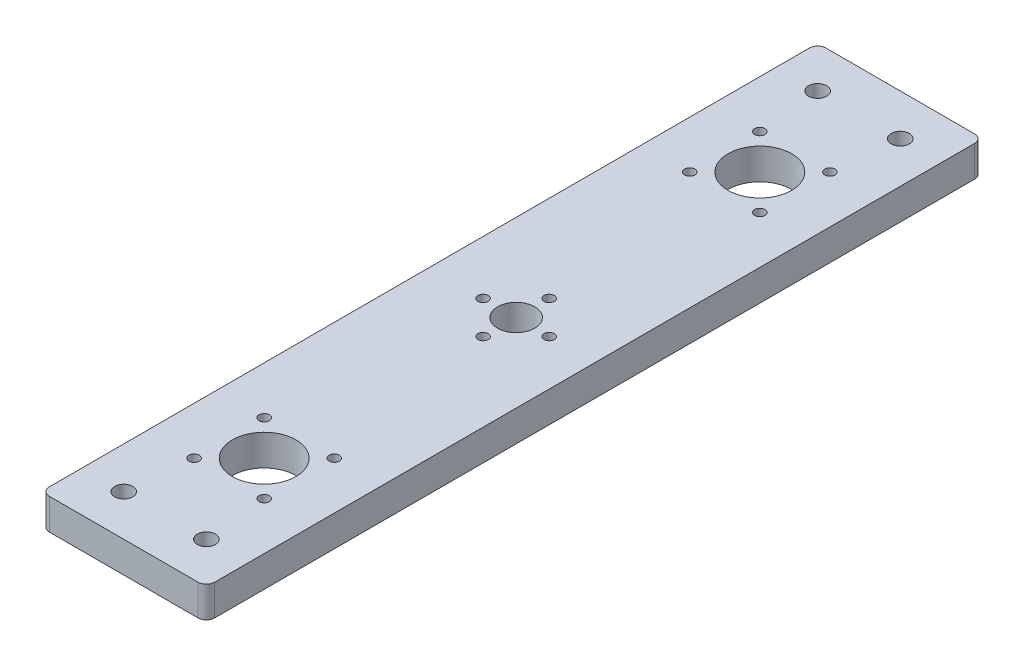
ISO-10303-21;
HEADER;
FILE_DESCRIPTION(('STEP AP214'),'2;1');
FILE_NAME('part.step','',(''),(''),'','','');
FILE_SCHEMA(('AUTOMOTIVE_DESIGN { 1 0 10303 214 1 1 1 1 }'));
ENDSEC;
DATA;
#1=APPLICATION_CONTEXT('core data for automotive mechanical design processes');
#2=APPLICATION_PROTOCOL_DEFINITION('international standard','automotive_design',2000,#1);
#3=PRODUCT_CONTEXT('',#1,'mechanical');
#4=PRODUCT('Part','Part','',(#3));
#5=PRODUCT_RELATED_PRODUCT_CATEGORY('part','',(#4));
#6=PRODUCT_DEFINITION_FORMATION('','',#4);
#7=PRODUCT_DEFINITION_CONTEXT('part definition',#1,'design');
#8=PRODUCT_DEFINITION('design','',#6,#7);
#9=PRODUCT_DEFINITION_SHAPE('','',#8);
#10=(LENGTH_UNIT() NAMED_UNIT(*) SI_UNIT(.MILLI.,.METRE.));
#11=(NAMED_UNIT(*) PLANE_ANGLE_UNIT() SI_UNIT($,.RADIAN.));
#12=(NAMED_UNIT(*) SI_UNIT($,.STERADIAN.) SOLID_ANGLE_UNIT());
#13=UNCERTAINTY_MEASURE_WITH_UNIT(LENGTH_MEASURE(1.E-05),#10,'distance_accuracy_value','');
#14=(GEOMETRIC_REPRESENTATION_CONTEXT(3) GLOBAL_UNCERTAINTY_ASSIGNED_CONTEXT((#13)) GLOBAL_UNIT_ASSIGNED_CONTEXT((#10,
#11,#12)) REPRESENTATION_CONTEXT('',''));
#15=CARTESIAN_POINT('',(0.,0.,0.));
#16=DIRECTION('',(0.,0.,1.));
#17=DIRECTION('',(1.,0.,0.));
#18=AXIS2_PLACEMENT_3D('',#15,#16,#17);
#19=CARTESIAN_POINT('',(0.,0.,0.));
#20=DIRECTION('',(0.,1.,0.));
#21=DIRECTION('',(0.,0.,1.));
#22=AXIS2_PLACEMENT_3D('',#19,#20,#21);
#23=PLANE('',#22);
#24=CARTESIAN_POINT('',(-8.48528137423856,0.,-68.4852813742386));
#25=DIRECTION('',(0.,-1.,0.));
#26=DIRECTION('',(0.,0.,-1.));
#27=AXIS2_PLACEMENT_3D('',#24,#25,#26);
#28=CIRCLE('',#27,1.25);
#29=CARTESIAN_POINT('',(-8.48528137423856,0.,-69.7352813742386));
#30=VERTEX_POINT('',#29);
#31=EDGE_CURVE('E270',#30,#30,#28,.T.);
#32=ORIENTED_EDGE('',*,*,#31,.F.);
#33=EDGE_LOOP('',(#32));
#34=FACE_BOUND('',#33,.T.);
#35=CARTESIAN_POINT('',(8.48528137423855,0.,-68.4852813742386));
#36=DIRECTION('',(0.,-1.,0.));
#37=DIRECTION('',(0.,0.,-1.));
#38=AXIS2_PLACEMENT_3D('',#35,#36,#37);
#39=CIRCLE('',#38,1.25);
#40=CARTESIAN_POINT('',(8.48528137423855,0.,-69.7352813742386));
#41=VERTEX_POINT('',#40);
#42=EDGE_CURVE('E264',#41,#41,#39,.T.);
#43=ORIENTED_EDGE('',*,*,#42,.F.);
#44=EDGE_LOOP('',(#43));
#45=FACE_BOUND('',#44,.T.);
#46=CARTESIAN_POINT('',(8.48528137423862,0.,-51.5147186257614));
#47=DIRECTION('',(0.,-1.,0.));
#48=DIRECTION('',(0.,0.,-1.));
#49=AXIS2_PLACEMENT_3D('',#46,#47,#48);
#50=CIRCLE('',#49,1.25);
#51=CARTESIAN_POINT('',(8.48528137423862,0.,-52.7647186257614));
#52=VERTEX_POINT('',#51);
#53=EDGE_CURVE('E258',#52,#52,#50,.T.);
#54=ORIENTED_EDGE('',*,*,#53,.F.);
#55=EDGE_LOOP('',(#54));
#56=FACE_BOUND('',#55,.T.);
#57=CARTESIAN_POINT('',(10.,0.,-84.));
#58=DIRECTION('',(0.,-1.,0.));
#59=DIRECTION('',(0.,0.,-1.));
#60=AXIS2_PLACEMENT_3D('',#57,#58,#59);
#61=CIRCLE('',#60,2.2);
#62=CARTESIAN_POINT('',(10.,0.,-86.2));
#63=VERTEX_POINT('',#62);
#64=EDGE_CURVE('E251',#63,#63,#61,.T.);
#65=ORIENTED_EDGE('',*,*,#64,.F.);
#66=EDGE_LOOP('',(#65));
#67=FACE_BOUND('',#66,.T.);
#68=CARTESIAN_POINT('',(-10.,0.,-84.));
#69=DIRECTION('',(0.,-1.,0.));
#70=DIRECTION('',(0.,0.,-1.));
#71=AXIS2_PLACEMENT_3D('',#68,#69,#70);
#72=CIRCLE('',#71,2.2);
#73=CARTESIAN_POINT('',(-10.,0.,-86.2));
#74=VERTEX_POINT('',#73);
#75=EDGE_CURVE('E244',#74,#74,#72,.T.);
#76=ORIENTED_EDGE('',*,*,#75,.F.);
#77=EDGE_LOOP('',(#76));
#78=FACE_BOUND('',#77,.T.);
#79=CARTESIAN_POINT('',(1.,0.,-8.));
#80=DIRECTION('',(0.,-1.,0.));
#81=DIRECTION('',(0.,0.,-1.));
#82=AXIS2_PLACEMENT_3D('',#79,#80,#81);
#83=CIRCLE('',#82,1.24999999999999);
#84=CARTESIAN_POINT('',(1.,0.,-9.24999999999999));
#85=VERTEX_POINT('',#84);
#86=EDGE_CURVE('E240',#85,#85,#83,.T.);
#87=ORIENTED_EDGE('',*,*,#86,.F.);
#88=EDGE_LOOP('',(#87));
#89=FACE_BOUND('',#88,.T.);
#90=CARTESIAN_POINT('',(-7.,0.,0.));
#91=DIRECTION('',(0.,-1.,0.));
#92=DIRECTION('',(0.,0.,-1.));
#93=AXIS2_PLACEMENT_3D('',#90,#91,#92);
#94=CIRCLE('',#93,1.24999999999999);
#95=CARTESIAN_POINT('',(-7.,0.,-1.24999999999999));
#96=VERTEX_POINT('',#95);
#97=EDGE_CURVE('E234',#96,#96,#94,.T.);
#98=ORIENTED_EDGE('',*,*,#97,.F.);
#99=EDGE_LOOP('',(#98));
#100=FACE_BOUND('',#99,.T.);
#101=CARTESIAN_POINT('',(9.,0.,0.));
#102=DIRECTION('',(0.,-1.,0.));
#103=DIRECTION('',(0.,0.,-1.));
#104=AXIS2_PLACEMENT_3D('',#101,#102,#103);
#105=CIRCLE('',#104,1.24999999999999);
#106=CARTESIAN_POINT('',(9.,0.,-1.24999999999999));
#107=VERTEX_POINT('',#106);
#108=EDGE_CURVE('E228',#107,#107,#105,.T.);
#109=ORIENTED_EDGE('',*,*,#108,.F.);
#110=EDGE_LOOP('',(#109));
#111=FACE_BOUND('',#110,.T.);
#112=CARTESIAN_POINT('',(1.,0.,8.));
#113=DIRECTION('',(0.,-1.,0.));
#114=DIRECTION('',(0.,0.,-1.));
#115=AXIS2_PLACEMENT_3D('',#112,#113,#114);
#116=CIRCLE('',#115,1.24999999999999);
#117=CARTESIAN_POINT('',(1.,0.,6.75000000000002));
#118=VERTEX_POINT('',#117);
#119=EDGE_CURVE('E222',#118,#118,#116,.T.);
#120=ORIENTED_EDGE('',*,*,#119,.F.);
#121=EDGE_LOOP('',(#120));
#122=FACE_BOUND('',#121,.T.);
#123=CARTESIAN_POINT('',(-8.48528137423844,0.,51.5147186257613));
#124=DIRECTION('',(0.,-1.,0.));
#125=DIRECTION('',(0.,0.,-1.));
#126=AXIS2_PLACEMENT_3D('',#123,#124,#125);
#127=CIRCLE('',#126,1.25);
#128=CARTESIAN_POINT('',(-8.48528137423844,0.,50.2647186257613));
#129=VERTEX_POINT('',#128);
#130=EDGE_CURVE('E216',#129,#129,#127,.T.);
#131=ORIENTED_EDGE('',*,*,#130,.F.);
#132=EDGE_LOOP('',(#131));
#133=FACE_BOUND('',#132,.T.);
#134=CARTESIAN_POINT('',(-8.48528137423856,0.,68.4852813742386));
#135=DIRECTION('',(0.,-1.,0.));
#136=DIRECTION('',(0.,0.,-1.));
#137=AXIS2_PLACEMENT_3D('',#134,#135,#136);
#138=CIRCLE('',#137,1.25);
#139=CARTESIAN_POINT('',(-8.48528137423856,0.,67.2352813742386));
#140=VERTEX_POINT('',#139);
#141=EDGE_CURVE('E210',#140,#140,#138,.T.);
#142=ORIENTED_EDGE('',*,*,#141,.F.);
#143=EDGE_LOOP('',(#142));
#144=FACE_BOUND('',#143,.T.);
#145=CARTESIAN_POINT('',(8.48528137423855,0.,68.4852813742386));
#146=DIRECTION('',(0.,-1.,0.));
#147=DIRECTION('',(0.,0.,-1.));
#148=AXIS2_PLACEMENT_3D('',#145,#146,#147);
#149=CIRCLE('',#148,1.25);
#150=CARTESIAN_POINT('',(8.48528137423855,0.,67.2352813742386));
#151=VERTEX_POINT('',#150);
#152=EDGE_CURVE('E204',#151,#151,#149,.T.);
#153=ORIENTED_EDGE('',*,*,#152,.F.);
#154=EDGE_LOOP('',(#153));
#155=FACE_BOUND('',#154,.T.);
#156=CARTESIAN_POINT('',(8.48528137423862,0.,51.5147186257614));
#157=DIRECTION('',(0.,-1.,0.));
#158=DIRECTION('',(0.,0.,-1.));
#159=AXIS2_PLACEMENT_3D('',#156,#157,#158);
#160=CIRCLE('',#159,1.25);
#161=CARTESIAN_POINT('',(8.48528137423862,0.,50.2647186257614));
#162=VERTEX_POINT('',#161);
#163=EDGE_CURVE('E198',#162,#162,#160,.T.);
#164=ORIENTED_EDGE('',*,*,#163,.F.);
#165=EDGE_LOOP('',(#164));
#166=FACE_BOUND('',#165,.T.);
#167=CARTESIAN_POINT('',(10.,0.,84.));
#168=DIRECTION('',(0.,1.,0.));
#169=DIRECTION('',(0.,0.,1.));
#170=AXIS2_PLACEMENT_3D('',#167,#168,#169);
#171=CIRCLE('',#170,2.2);
#172=CARTESIAN_POINT('',(10.,0.,86.2));
#173=VERTEX_POINT('',#172);
#174=EDGE_CURVE('E191',#173,#173,#171,.T.);
#175=ORIENTED_EDGE('',*,*,#174,.T.);
#176=EDGE_LOOP('',(#175));
#177=FACE_BOUND('',#176,.T.);
#178=CARTESIAN_POINT('',(-10.,0.,84.));
#179=DIRECTION('',(0.,1.,0.));
#180=DIRECTION('',(0.,0.,1.));
#181=AXIS2_PLACEMENT_3D('',#178,#179,#180);
#182=CIRCLE('',#181,2.2);
#183=CARTESIAN_POINT('',(-10.,0.,86.2));
#184=VERTEX_POINT('',#183);
#185=EDGE_CURVE('E184',#184,#184,#182,.T.);
#186=ORIENTED_EDGE('',*,*,#185,.T.);
#187=EDGE_LOOP('',(#186));
#188=FACE_BOUND('',#187,.T.);
#189=CARTESIAN_POINT('',(0.,0.,-60.));
#190=DIRECTION('',(0.,1.,0.));
#191=DIRECTION('',(0.,0.,1.));
#192=AXIS2_PLACEMENT_3D('',#189,#190,#191);
#193=CIRCLE('',#192,7.7);
#194=CARTESIAN_POINT('',(0.,0.,-52.3));
#195=VERTEX_POINT('',#194);
#196=EDGE_CURVE('E118',#195,#195,#193,.T.);
#197=ORIENTED_EDGE('',*,*,#196,.T.);
#198=EDGE_LOOP('',(#197));
#199=FACE_BOUND('',#198,.T.);
#200=CARTESIAN_POINT('',(0.,0.,60.));
#201=DIRECTION('',(0.,1.,0.));
#202=DIRECTION('',(0.,0.,1.));
#203=AXIS2_PLACEMENT_3D('',#200,#201,#202);
#204=CIRCLE('',#203,7.7);
#205=CARTESIAN_POINT('',(0.,0.,67.7));
#206=VERTEX_POINT('',#205);
#207=EDGE_CURVE('E176',#206,#206,#204,.T.);
#208=ORIENTED_EDGE('',*,*,#207,.T.);
#209=EDGE_LOOP('',(#208));
#210=FACE_BOUND('',#209,.T.);
#211=CARTESIAN_POINT('',(1.,0.,0.));
#212=DIRECTION('',(0.,1.,0.));
#213=DIRECTION('',(0.,0.,1.));
#214=AXIS2_PLACEMENT_3D('',#211,#212,#213);
#215=CIRCLE('',#214,4.5);
#216=CARTESIAN_POINT('',(1.,0.,4.5));
#217=VERTEX_POINT('',#216);
#218=EDGE_CURVE('E169',#217,#217,#215,.T.);
#219=ORIENTED_EDGE('',*,*,#218,.T.);
#220=EDGE_LOOP('',(#219));
#221=FACE_BOUND('',#220,.T.);
#222=DIRECTION('',(0.,0.,1.));
#223=VECTOR('',#222,1.);
#224=CARTESIAN_POINT('',(-20.,0.,94.));
#225=LINE('',#224,#223);
#226=CARTESIAN_POINT('',(-20.,0.,-92.));
#227=VERTEX_POINT('',#226);
#228=CARTESIAN_POINT('',(-20.,0.,92.));
#229=VERTEX_POINT('',#228);
#230=EDGE_CURVE('E101',#227,#229,#225,.T.);
#231=ORIENTED_EDGE('',*,*,#230,.F.);
#232=CARTESIAN_POINT('',(-18.,0.,-92.));
#233=DIRECTION('',(0.,1.,0.));
#234=DIRECTION('',(0.,0.,1.));
#235=AXIS2_PLACEMENT_3D('',#232,#233,#234);
#236=CIRCLE('',#235,2.);
#237=CARTESIAN_POINT('',(-18.,0.,-94.));
#238=VERTEX_POINT('',#237);
#239=EDGE_CURVE('E84',#227,#238,#236,.F.);
#240=ORIENTED_EDGE('',*,*,#239,.T.);
#241=DIRECTION('',(-1.,0.,0.));
#242=VECTOR('',#241,1.);
#243=CARTESIAN_POINT('',(20.,0.,-94.));
#244=LINE('',#243,#242);
#245=CARTESIAN_POINT('',(18.,0.,-94.));
#246=VERTEX_POINT('',#245);
#247=EDGE_CURVE('E125',#246,#238,#244,.T.);
#248=ORIENTED_EDGE('',*,*,#247,.F.);
#249=CARTESIAN_POINT('',(18.,0.,-92.));
#250=DIRECTION('',(0.,1.,0.));
#251=DIRECTION('',(0.,0.,1.));
#252=AXIS2_PLACEMENT_3D('',#249,#250,#251);
#253=CIRCLE('',#252,2.);
#254=CARTESIAN_POINT('',(20.,0.,-92.));
#255=VERTEX_POINT('',#254);
#256=EDGE_CURVE('E95',#246,#255,#253,.F.);
#257=ORIENTED_EDGE('',*,*,#256,.T.);
#258=DIRECTION('',(0.,0.,-1.));
#259=VECTOR('',#258,1.);
#260=CARTESIAN_POINT('',(20.,0.,94.));
#261=LINE('',#260,#259);
#262=CARTESIAN_POINT('',(20.,0.,92.));
#263=VERTEX_POINT('',#262);
#264=EDGE_CURVE('E115',#263,#255,#261,.T.);
#265=ORIENTED_EDGE('',*,*,#264,.F.);
#266=CARTESIAN_POINT('',(18.,0.,92.));
#267=DIRECTION('',(0.,1.,0.));
#268=DIRECTION('',(0.,0.,1.));
#269=AXIS2_PLACEMENT_3D('',#266,#267,#268);
#270=CIRCLE('',#269,2.);
#271=CARTESIAN_POINT('',(18.,0.,94.));
#272=VERTEX_POINT('',#271);
#273=EDGE_CURVE('E105',#263,#272,#270,.F.);
#274=ORIENTED_EDGE('',*,*,#273,.T.);
#275=DIRECTION('',(1.,0.,0.));
#276=VECTOR('',#275,1.);
#277=CARTESIAN_POINT('',(20.,0.,94.));
#278=LINE('',#277,#276);
#279=CARTESIAN_POINT('',(-18.,0.,94.));
#280=VERTEX_POINT('',#279);
#281=EDGE_CURVE('E111',#280,#272,#278,.T.);
#282=ORIENTED_EDGE('',*,*,#281,.F.);
#283=CARTESIAN_POINT('',(-18.,0.,92.));
#284=DIRECTION('',(0.,1.,0.));
#285=DIRECTION('',(0.,0.,1.));
#286=AXIS2_PLACEMENT_3D('',#283,#284,#285);
#287=CIRCLE('',#286,2.);
#288=EDGE_CURVE('E110',#280,#229,#287,.F.);
#289=ORIENTED_EDGE('',*,*,#288,.T.);
#290=EDGE_LOOP('',(#231,#240,#248,#257,#265,#274,#282,#289));
#291=FACE_BOUND('',#290,.T.);
#292=CARTESIAN_POINT('',(-8.48528137423844,0.,-51.5147186257613));
#293=DIRECTION('',(0.,-1.,0.));
#294=DIRECTION('',(0.,0.,-1.));
#295=AXIS2_PLACEMENT_3D('',#292,#293,#294);
#296=CIRCLE('',#295,1.25);
#297=CARTESIAN_POINT('',(-8.48528137423844,0.,-52.7647186257613));
#298=VERTEX_POINT('',#297);
#299=EDGE_CURVE('E276',#298,#298,#296,.T.);
#300=ORIENTED_EDGE('',*,*,#299,.F.);
#301=EDGE_LOOP('',(#300));
#302=FACE_BOUND('',#301,.T.);
#303=ADVANCED_FACE('F17',(#34,#45,#56,#67,#78,#89,#100,#111,#122,#133,#144,#155,#166,#177,#188,
#199,#210,#221,#291,#302),#23,.F.);
#304=CARTESIAN_POINT('',(0.,7.5,0.));
#305=DIRECTION('',(0.,1.,0.));
#306=DIRECTION('',(0.,0.,1.));
#307=AXIS2_PLACEMENT_3D('',#304,#305,#306);
#308=PLANE('',#307);
#309=CARTESIAN_POINT('',(-8.48528137423856,7.5,-68.4852813742386));
#310=DIRECTION('',(0.,-1.,0.));
#311=DIRECTION('',(0.,0.,-1.));
#312=AXIS2_PLACEMENT_3D('',#309,#310,#311);
#313=CIRCLE('',#312,1.25);
#314=CARTESIAN_POINT('',(-8.48528137423856,7.5,-69.7352813742386));
#315=VERTEX_POINT('',#314);
#316=EDGE_CURVE('E267',#315,#315,#313,.T.);
#317=ORIENTED_EDGE('',*,*,#316,.T.);
#318=EDGE_LOOP('',(#317));
#319=FACE_BOUND('',#318,.T.);
#320=CARTESIAN_POINT('',(8.48528137423862,7.5,-51.5147186257614));
#321=DIRECTION('',(0.,-1.,0.));
#322=DIRECTION('',(0.,0.,-1.));
#323=AXIS2_PLACEMENT_3D('',#320,#321,#322);
#324=CIRCLE('',#323,1.25);
#325=CARTESIAN_POINT('',(8.48528137423862,7.5,-52.7647186257614));
#326=VERTEX_POINT('',#325);
#327=EDGE_CURVE('E248',#326,#326,#324,.T.);
#328=ORIENTED_EDGE('',*,*,#327,.T.);
#329=EDGE_LOOP('',(#328));
#330=FACE_BOUND('',#329,.T.);
#331=CARTESIAN_POINT('',(10.,7.5,-84.));
#332=DIRECTION('',(0.,-1.,0.));
#333=DIRECTION('',(0.,0.,-1.));
#334=AXIS2_PLACEMENT_3D('',#331,#332,#333);
#335=CIRCLE('',#334,2.2);
#336=CARTESIAN_POINT('',(10.,7.5,-86.2));
#337=VERTEX_POINT('',#336);
#338=EDGE_CURVE('E243',#337,#337,#335,.T.);
#339=ORIENTED_EDGE('',*,*,#338,.T.);
#340=EDGE_LOOP('',(#339));
#341=FACE_BOUND('',#340,.T.);
#342=CARTESIAN_POINT('',(-10.,7.5,-84.));
#343=DIRECTION('',(0.,-1.,0.));
#344=DIRECTION('',(0.,0.,-1.));
#345=AXIS2_PLACEMENT_3D('',#342,#343,#344);
#346=CIRCLE('',#345,2.2);
#347=CARTESIAN_POINT('',(-10.,7.5,-86.2));
#348=VERTEX_POINT('',#347);
#349=EDGE_CURVE('E247',#348,#348,#346,.T.);
#350=ORIENTED_EDGE('',*,*,#349,.T.);
#351=EDGE_LOOP('',(#350));
#352=FACE_BOUND('',#351,.T.);
#353=CARTESIAN_POINT('',(1.,7.5,-8.));
#354=DIRECTION('',(0.,-1.,0.));
#355=DIRECTION('',(0.,0.,-1.));
#356=AXIS2_PLACEMENT_3D('',#353,#354,#355);
#357=CIRCLE('',#356,1.25);
#358=CARTESIAN_POINT('',(1.,7.5,-9.25));
#359=VERTEX_POINT('',#358);
#360=EDGE_CURVE('E237',#359,#359,#357,.T.);
#361=ORIENTED_EDGE('',*,*,#360,.T.);
#362=EDGE_LOOP('',(#361));
#363=FACE_BOUND('',#362,.T.);
#364=CARTESIAN_POINT('',(-7.,7.5,0.));
#365=DIRECTION('',(0.,-1.,0.));
#366=DIRECTION('',(0.,0.,-1.));
#367=AXIS2_PLACEMENT_3D('',#364,#365,#366);
#368=CIRCLE('',#367,1.25);
#369=CARTESIAN_POINT('',(-7.,7.5,-1.25));
#370=VERTEX_POINT('',#369);
#371=EDGE_CURVE('E231',#370,#370,#368,.T.);
#372=ORIENTED_EDGE('',*,*,#371,.T.);
#373=EDGE_LOOP('',(#372));
#374=FACE_BOUND('',#373,.T.);
#375=DIRECTION('',(-1.,0.,0.));
#376=VECTOR('',#375,1.);
#377=CARTESIAN_POINT('',(20.,7.5,-94.));
#378=LINE('',#377,#376);
#379=CARTESIAN_POINT('',(18.,7.5,-94.));
#380=VERTEX_POINT('',#379);
#381=CARTESIAN_POINT('',(-18.,7.5,-94.));
#382=VERTEX_POINT('',#381);
#383=EDGE_CURVE('E121',#380,#382,#378,.T.);
#384=ORIENTED_EDGE('',*,*,#383,.T.);
#385=CARTESIAN_POINT('',(-18.,7.5,-92.));
#386=DIRECTION('',(0.,1.,0.));
#387=DIRECTION('',(0.,0.,1.));
#388=AXIS2_PLACEMENT_3D('',#385,#386,#387);
#389=CIRCLE('',#388,2.);
#390=CARTESIAN_POINT('',(-20.,7.5,-92.));
#391=VERTEX_POINT('',#390);
#392=EDGE_CURVE('E139',#382,#391,#389,.T.);
#393=ORIENTED_EDGE('',*,*,#392,.T.);
#394=DIRECTION('',(0.,0.,1.));
#395=VECTOR('',#394,1.);
#396=CARTESIAN_POINT('',(-20.,7.5,94.));
#397=LINE('',#396,#395);
#398=CARTESIAN_POINT('',(-20.,7.5,92.));
#399=VERTEX_POINT('',#398);
#400=EDGE_CURVE('E104',#391,#399,#397,.T.);
#401=ORIENTED_EDGE('',*,*,#400,.T.);
#402=CARTESIAN_POINT('',(-18.,7.5,92.));
#403=DIRECTION('',(0.,1.,0.));
#404=DIRECTION('',(0.,0.,1.));
#405=AXIS2_PLACEMENT_3D('',#402,#403,#404);
#406=CIRCLE('',#405,2.);
#407=CARTESIAN_POINT('',(-18.,7.5,94.));
#408=VERTEX_POINT('',#407);
#409=EDGE_CURVE('E135',#399,#408,#406,.T.);
#410=ORIENTED_EDGE('',*,*,#409,.T.);
#411=DIRECTION('',(1.,0.,0.));
#412=VECTOR('',#411,1.);
#413=CARTESIAN_POINT('',(20.,7.5,94.));
#414=LINE('',#413,#412);
#415=CARTESIAN_POINT('',(18.,7.5,94.));
#416=VERTEX_POINT('',#415);
#417=EDGE_CURVE('E148',#408,#416,#414,.T.);
#418=ORIENTED_EDGE('',*,*,#417,.T.);
#419=CARTESIAN_POINT('',(18.,7.5,92.));
#420=DIRECTION('',(0.,1.,0.));
#421=DIRECTION('',(0.,0.,1.));
#422=AXIS2_PLACEMENT_3D('',#419,#420,#421);
#423=CIRCLE('',#422,2.);
#424=CARTESIAN_POINT('',(20.,7.5,92.));
#425=VERTEX_POINT('',#424);
#426=EDGE_CURVE('E39',#416,#425,#423,.T.);
#427=ORIENTED_EDGE('',*,*,#426,.T.);
#428=DIRECTION('',(0.,0.,-1.));
#429=VECTOR('',#428,1.);
#430=CARTESIAN_POINT('',(20.,7.5,94.));
#431=LINE('',#430,#429);
#432=CARTESIAN_POINT('',(20.,7.5,-92.));
#433=VERTEX_POINT('',#432);
#434=EDGE_CURVE('E155',#425,#433,#431,.T.);
#435=ORIENTED_EDGE('',*,*,#434,.T.);
#436=CARTESIAN_POINT('',(18.,7.5,-92.));
#437=DIRECTION('',(0.,1.,0.));
#438=DIRECTION('',(0.,0.,1.));
#439=AXIS2_PLACEMENT_3D('',#436,#437,#438);
#440=CIRCLE('',#439,2.);
#441=EDGE_CURVE('E137',#433,#380,#440,.T.);
#442=ORIENTED_EDGE('',*,*,#441,.T.);
#443=EDGE_LOOP('',(#384,#393,#401,#410,#418,#427,#435,#442));
#444=FACE_BOUND('',#443,.T.);
#445=CARTESIAN_POINT('',(1.,7.5,0.));
#446=DIRECTION('',(0.,1.,0.));
#447=DIRECTION('',(0.,0.,1.));
#448=AXIS2_PLACEMENT_3D('',#445,#446,#447);
#449=CIRCLE('',#448,4.5);
#450=CARTESIAN_POINT('',(1.,7.5,4.5));
#451=VERTEX_POINT('',#450);
#452=EDGE_CURVE('E172',#451,#451,#449,.T.);
#453=ORIENTED_EDGE('',*,*,#452,.F.);
#454=EDGE_LOOP('',(#453));
#455=FACE_BOUND('',#454,.T.);
#456=CARTESIAN_POINT('',(0.,7.5,60.));
#457=DIRECTION('',(0.,1.,0.));
#458=DIRECTION('',(0.,0.,1.));
#459=AXIS2_PLACEMENT_3D('',#456,#457,#458);
#460=CIRCLE('',#459,7.7);
#461=CARTESIAN_POINT('',(0.,7.5,67.7));
#462=VERTEX_POINT('',#461);
#463=EDGE_CURVE('E179',#462,#462,#460,.T.);
#464=ORIENTED_EDGE('',*,*,#463,.F.);
#465=EDGE_LOOP('',(#464));
#466=FACE_BOUND('',#465,.T.);
#467=CARTESIAN_POINT('',(0.,7.5,-60.));
#468=DIRECTION('',(0.,1.,0.));
#469=DIRECTION('',(0.,0.,1.));
#470=AXIS2_PLACEMENT_3D('',#467,#468,#469);
#471=CIRCLE('',#470,7.7);
#472=CARTESIAN_POINT('',(0.,7.5,-52.3));
#473=VERTEX_POINT('',#472);
#474=EDGE_CURVE('E112',#473,#473,#471,.T.);
#475=ORIENTED_EDGE('',*,*,#474,.F.);
#476=EDGE_LOOP('',(#475));
#477=FACE_BOUND('',#476,.T.);
#478=CARTESIAN_POINT('',(-10.,7.5,84.));
#479=DIRECTION('',(0.,1.,0.));
#480=DIRECTION('',(0.,0.,1.));
#481=AXIS2_PLACEMENT_3D('',#478,#479,#480);
#482=CIRCLE('',#481,2.2);
#483=CARTESIAN_POINT('',(-10.,7.5,86.2));
#484=VERTEX_POINT('',#483);
#485=EDGE_CURVE('E187',#484,#484,#482,.T.);
#486=ORIENTED_EDGE('',*,*,#485,.F.);
#487=EDGE_LOOP('',(#486));
#488=FACE_BOUND('',#487,.T.);
#489=CARTESIAN_POINT('',(10.,7.5,84.));
#490=DIRECTION('',(0.,1.,0.));
#491=DIRECTION('',(0.,0.,1.));
#492=AXIS2_PLACEMENT_3D('',#489,#490,#491);
#493=CIRCLE('',#492,2.2);
#494=CARTESIAN_POINT('',(10.,7.5,86.2));
#495=VERTEX_POINT('',#494);
#496=EDGE_CURVE('E173',#495,#495,#493,.T.);
#497=ORIENTED_EDGE('',*,*,#496,.F.);
#498=EDGE_LOOP('',(#497));
#499=FACE_BOUND('',#498,.T.);
#500=CARTESIAN_POINT('',(8.48528137423862,7.5,51.5147186257614));
#501=DIRECTION('',(0.,-1.,0.));
#502=DIRECTION('',(0.,0.,-1.));
#503=AXIS2_PLACEMENT_3D('',#500,#501,#502);
#504=CIRCLE('',#503,1.25);
#505=CARTESIAN_POINT('',(8.48528137423862,7.5,50.2647186257614));
#506=VERTEX_POINT('',#505);
#507=EDGE_CURVE('E188',#506,#506,#504,.T.);
#508=ORIENTED_EDGE('',*,*,#507,.T.);
#509=EDGE_LOOP('',(#508));
#510=FACE_BOUND('',#509,.T.);
#511=CARTESIAN_POINT('',(8.48528137423855,7.5,68.4852813742386));
#512=DIRECTION('',(0.,-1.,0.));
#513=DIRECTION('',(0.,0.,-1.));
#514=AXIS2_PLACEMENT_3D('',#511,#512,#513);
#515=CIRCLE('',#514,1.25);
#516=CARTESIAN_POINT('',(8.48528137423855,7.5,67.2352813742386));
#517=VERTEX_POINT('',#516);
#518=EDGE_CURVE('E201',#517,#517,#515,.T.);
#519=ORIENTED_EDGE('',*,*,#518,.T.);
#520=EDGE_LOOP('',(#519));
#521=FACE_BOUND('',#520,.T.);
#522=CARTESIAN_POINT('',(-8.48528137423856,7.5,68.4852813742386));
#523=DIRECTION('',(0.,-1.,0.));
#524=DIRECTION('',(0.,0.,-1.));
#525=AXIS2_PLACEMENT_3D('',#522,#523,#524);
#526=CIRCLE('',#525,1.25);
#527=CARTESIAN_POINT('',(-8.48528137423856,7.5,67.2352813742386));
#528=VERTEX_POINT('',#527);
#529=EDGE_CURVE('E207',#528,#528,#526,.T.);
#530=ORIENTED_EDGE('',*,*,#529,.T.);
#531=EDGE_LOOP('',(#530));
#532=FACE_BOUND('',#531,.T.);
#533=CARTESIAN_POINT('',(-8.48528137423844,7.5,51.5147186257613));
#534=DIRECTION('',(0.,-1.,0.));
#535=DIRECTION('',(0.,0.,-1.));
#536=AXIS2_PLACEMENT_3D('',#533,#534,#535);
#537=CIRCLE('',#536,1.25);
#538=CARTESIAN_POINT('',(-8.48528137423844,7.5,50.2647186257613));
#539=VERTEX_POINT('',#538);
#540=EDGE_CURVE('E213',#539,#539,#537,.T.);
#541=ORIENTED_EDGE('',*,*,#540,.T.);
#542=EDGE_LOOP('',(#541));
#543=FACE_BOUND('',#542,.T.);
#544=CARTESIAN_POINT('',(1.,7.5,8.));
#545=DIRECTION('',(0.,-1.,0.));
#546=DIRECTION('',(0.,0.,-1.));
#547=AXIS2_PLACEMENT_3D('',#544,#545,#546);
#548=CIRCLE('',#547,1.25);
#549=CARTESIAN_POINT('',(1.,7.5,6.75));
#550=VERTEX_POINT('',#549);
#551=EDGE_CURVE('E219',#550,#550,#548,.T.);
#552=ORIENTED_EDGE('',*,*,#551,.T.);
#553=EDGE_LOOP('',(#552));
#554=FACE_BOUND('',#553,.T.);
#555=CARTESIAN_POINT('',(9.,7.5,0.));
#556=DIRECTION('',(0.,-1.,0.));
#557=DIRECTION('',(0.,0.,-1.));
#558=AXIS2_PLACEMENT_3D('',#555,#556,#557);
#559=CIRCLE('',#558,1.25);
#560=CARTESIAN_POINT('',(9.,7.5,-1.25));
#561=VERTEX_POINT('',#560);
#562=EDGE_CURVE('E225',#561,#561,#559,.T.);
#563=ORIENTED_EDGE('',*,*,#562,.T.);
#564=EDGE_LOOP('',(#563));
#565=FACE_BOUND('',#564,.T.);
#566=CARTESIAN_POINT('',(8.48528137423855,7.5,-68.4852813742386));
#567=DIRECTION('',(0.,-1.,0.));
#568=DIRECTION('',(0.,0.,-1.));
#569=AXIS2_PLACEMENT_3D('',#566,#567,#568);
#570=CIRCLE('',#569,1.25);
#571=CARTESIAN_POINT('',(8.48528137423855,7.5,-69.7352813742386));
#572=VERTEX_POINT('',#571);
#573=EDGE_CURVE('E261',#572,#572,#570,.T.);
#574=ORIENTED_EDGE('',*,*,#573,.T.);
#575=EDGE_LOOP('',(#574));
#576=FACE_BOUND('',#575,.T.);
#577=CARTESIAN_POINT('',(-8.48528137423844,7.5,-51.5147186257613));
#578=DIRECTION('',(0.,-1.,0.));
#579=DIRECTION('',(0.,0.,-1.));
#580=AXIS2_PLACEMENT_3D('',#577,#578,#579);
#581=CIRCLE('',#580,1.25);
#582=CARTESIAN_POINT('',(-8.48528137423844,7.5,-52.7647186257613));
#583=VERTEX_POINT('',#582);
#584=EDGE_CURVE('E273',#583,#583,#581,.T.);
#585=ORIENTED_EDGE('',*,*,#584,.T.);
#586=EDGE_LOOP('',(#585));
#587=FACE_BOUND('',#586,.T.);
#588=ADVANCED_FACE('F152',(#319,#330,#341,#352,#363,#374,#444,#455,#466,#477,#488,#499,#510,
#521,#532,#543,#554,#565,#576,#587),#308,.T.);
#589=CARTESIAN_POINT('',(-20.,7.5,94.));
#590=DIRECTION('',(1.,0.,0.));
#591=DIRECTION('',(0.,0.,-1.));
#592=AXIS2_PLACEMENT_3D('',#589,#590,#591);
#593=PLANE('',#592);
#594=ORIENTED_EDGE('',*,*,#400,.F.);
#595=DIRECTION('',(0.,-1.,0.));
#596=VECTOR('',#595,1.);
#597=CARTESIAN_POINT('',(-20.,7.5,-92.));
#598=LINE('',#597,#596);
#599=EDGE_CURVE('E88',#391,#227,#598,.T.);
#600=ORIENTED_EDGE('',*,*,#599,.T.);
#601=ORIENTED_EDGE('',*,*,#230,.T.);
#602=DIRECTION('',(0.,-1.,0.));
#603=VECTOR('',#602,1.);
#604=CARTESIAN_POINT('',(-20.,7.5,92.));
#605=LINE('',#604,#603);
#606=EDGE_CURVE('E106',#229,#399,#605,.F.);
#607=ORIENTED_EDGE('',*,*,#606,.T.);
#608=EDGE_LOOP('',(#594,#600,#601,#607));
#609=FACE_BOUND('',#608,.T.);
#610=ADVANCED_FACE('F100',(#609),#593,.F.);
#611=CARTESIAN_POINT('',(20.,7.5,94.));
#612=DIRECTION('',(0.,0.,-1.));
#613=DIRECTION('',(-1.,0.,0.));
#614=AXIS2_PLACEMENT_3D('',#611,#612,#613);
#615=PLANE('',#614);
#616=ORIENTED_EDGE('',*,*,#417,.F.);
#617=DIRECTION('',(0.,-1.,0.));
#618=VECTOR('',#617,1.);
#619=CARTESIAN_POINT('',(-18.,7.5,94.));
#620=LINE('',#619,#618);
#621=EDGE_CURVE('E11',#408,#280,#620,.T.);
#622=ORIENTED_EDGE('',*,*,#621,.T.);
#623=ORIENTED_EDGE('',*,*,#281,.T.);
#624=DIRECTION('',(0.,-1.,0.));
#625=VECTOR('',#624,1.);
#626=CARTESIAN_POINT('',(18.,7.5,94.));
#627=LINE('',#626,#625);
#628=EDGE_CURVE('E25',#272,#416,#627,.F.);
#629=ORIENTED_EDGE('',*,*,#628,.T.);
#630=EDGE_LOOP('',(#616,#622,#623,#629));
#631=FACE_BOUND('',#630,.T.);
#632=ADVANCED_FACE('F147',(#631),#615,.F.);
#633=CARTESIAN_POINT('',(20.,7.5,94.));
#634=DIRECTION('',(-1.,0.,0.));
#635=DIRECTION('',(0.,0.,1.));
#636=AXIS2_PLACEMENT_3D('',#633,#634,#635);
#637=PLANE('',#636);
#638=ORIENTED_EDGE('',*,*,#264,.T.);
#639=DIRECTION('',(0.,-1.,0.));
#640=VECTOR('',#639,1.);
#641=CARTESIAN_POINT('',(20.,7.5,-92.));
#642=LINE('',#641,#640);
#643=EDGE_CURVE('E32',#255,#433,#642,.F.);
#644=ORIENTED_EDGE('',*,*,#643,.T.);
#645=ORIENTED_EDGE('',*,*,#434,.F.);
#646=DIRECTION('',(0.,-1.,0.));
#647=VECTOR('',#646,1.);
#648=CARTESIAN_POINT('',(20.,7.5,92.));
#649=LINE('',#648,#647);
#650=EDGE_CURVE('E141',#425,#263,#649,.T.);
#651=ORIENTED_EDGE('',*,*,#650,.T.);
#652=EDGE_LOOP('',(#638,#644,#645,#651));
#653=FACE_BOUND('',#652,.T.);
#654=ADVANCED_FACE('F159',(#653),#637,.F.);
#655=CARTESIAN_POINT('',(20.,7.5,-94.));
#656=DIRECTION('',(0.,0.,1.));
#657=DIRECTION('',(1.,0.,0.));
#658=AXIS2_PLACEMENT_3D('',#655,#656,#657);
#659=PLANE('',#658);
#660=ORIENTED_EDGE('',*,*,#247,.T.);
#661=DIRECTION('',(0.,-1.,0.));
#662=VECTOR('',#661,1.);
#663=CARTESIAN_POINT('',(-18.,7.5,-94.));
#664=LINE('',#663,#662);
#665=EDGE_CURVE('E89',#238,#382,#664,.F.);
#666=ORIENTED_EDGE('',*,*,#665,.T.);
#667=ORIENTED_EDGE('',*,*,#383,.F.);
#668=DIRECTION('',(0.,-1.,0.));
#669=VECTOR('',#668,1.);
#670=CARTESIAN_POINT('',(18.,7.5,-94.));
#671=LINE('',#670,#669);
#672=EDGE_CURVE('E94',#380,#246,#671,.T.);
#673=ORIENTED_EDGE('',*,*,#672,.T.);
#674=EDGE_LOOP('',(#660,#666,#667,#673));
#675=FACE_BOUND('',#674,.T.);
#676=ADVANCED_FACE('F166',(#675),#659,.F.);
#677=CARTESIAN_POINT('',(1.,7.5,0.));
#678=DIRECTION('',(0.,-1.,0.));
#679=DIRECTION('',(0.,0.,-1.));
#680=AXIS2_PLACEMENT_3D('',#677,#678,#679);
#681=CYLINDRICAL_SURFACE('',#680,4.5);
#682=ORIENTED_EDGE('',*,*,#452,.T.);
#683=EDGE_LOOP('',(#682));
#684=FACE_BOUND('',#683,.T.);
#685=ORIENTED_EDGE('',*,*,#218,.F.);
#686=EDGE_LOOP('',(#685));
#687=FACE_BOUND('',#686,.T.);
#688=ADVANCED_FACE('F297',(#684,#687),#681,.F.);
#689=CARTESIAN_POINT('',(0.,7.5,60.));
#690=DIRECTION('',(0.,-1.,0.));
#691=DIRECTION('',(0.,0.,-1.));
#692=AXIS2_PLACEMENT_3D('',#689,#690,#691);
#693=CYLINDRICAL_SURFACE('',#692,7.7);
#694=ORIENTED_EDGE('',*,*,#463,.T.);
#695=EDGE_LOOP('',(#694));
#696=FACE_BOUND('',#695,.T.);
#697=ORIENTED_EDGE('',*,*,#207,.F.);
#698=EDGE_LOOP('',(#697));
#699=FACE_BOUND('',#698,.T.);
#700=ADVANCED_FACE('F506',(#696,#699),#693,.F.);
#701=CARTESIAN_POINT('',(0.,7.5,-60.));
#702=DIRECTION('',(0.,-1.,0.));
#703=DIRECTION('',(0.,0.,-1.));
#704=AXIS2_PLACEMENT_3D('',#701,#702,#703);
#705=CYLINDRICAL_SURFACE('',#704,7.7);
#706=ORIENTED_EDGE('',*,*,#474,.T.);
#707=EDGE_LOOP('',(#706));
#708=FACE_BOUND('',#707,.T.);
#709=ORIENTED_EDGE('',*,*,#196,.F.);
#710=EDGE_LOOP('',(#709));
#711=FACE_BOUND('',#710,.T.);
#712=ADVANCED_FACE('F496',(#708,#711),#705,.F.);
#713=CARTESIAN_POINT('',(-10.,7.5,84.));
#714=DIRECTION('',(0.,-1.,0.));
#715=DIRECTION('',(0.,0.,-1.));
#716=AXIS2_PLACEMENT_3D('',#713,#714,#715);
#717=CYLINDRICAL_SURFACE('',#716,2.2);
#718=ORIENTED_EDGE('',*,*,#485,.T.);
#719=EDGE_LOOP('',(#718));
#720=FACE_BOUND('',#719,.T.);
#721=ORIENTED_EDGE('',*,*,#185,.F.);
#722=EDGE_LOOP('',(#721));
#723=FACE_BOUND('',#722,.T.);
#724=ADVANCED_FACE('F486',(#720,#723),#717,.F.);
#725=CARTESIAN_POINT('',(10.,7.5,84.));
#726=DIRECTION('',(0.,-1.,0.));
#727=DIRECTION('',(0.,0.,-1.));
#728=AXIS2_PLACEMENT_3D('',#725,#726,#727);
#729=CYLINDRICAL_SURFACE('',#728,2.2);
#730=ORIENTED_EDGE('',*,*,#496,.T.);
#731=EDGE_LOOP('',(#730));
#732=FACE_BOUND('',#731,.T.);
#733=ORIENTED_EDGE('',*,*,#174,.F.);
#734=EDGE_LOOP('',(#733));
#735=FACE_BOUND('',#734,.T.);
#736=ADVANCED_FACE('F476',(#732,#735),#729,.F.);
#737=CARTESIAN_POINT('',(8.48528137423862,0.,51.5147186257614));
#738=DIRECTION('',(0.,-1.,0.));
#739=DIRECTION('',(0.,0.,-1.));
#740=AXIS2_PLACEMENT_3D('',#737,#738,#739);
#741=CYLINDRICAL_SURFACE('',#740,1.25);
#742=ORIENTED_EDGE('',*,*,#507,.F.);
#743=EDGE_LOOP('',(#742));
#744=FACE_BOUND('',#743,.T.);
#745=ORIENTED_EDGE('',*,*,#163,.T.);
#746=EDGE_LOOP('',(#745));
#747=FACE_BOUND('',#746,.T.);
#748=ADVANCED_FACE('F466',(#744,#747),#741,.F.);
#749=CARTESIAN_POINT('',(8.48528137423855,0.,68.4852813742386));
#750=DIRECTION('',(0.,-1.,0.));
#751=DIRECTION('',(0.,0.,-1.));
#752=AXIS2_PLACEMENT_3D('',#749,#750,#751);
#753=CYLINDRICAL_SURFACE('',#752,1.25);
#754=ORIENTED_EDGE('',*,*,#518,.F.);
#755=EDGE_LOOP('',(#754));
#756=FACE_BOUND('',#755,.T.);
#757=ORIENTED_EDGE('',*,*,#152,.T.);
#758=EDGE_LOOP('',(#757));
#759=FACE_BOUND('',#758,.T.);
#760=ADVANCED_FACE('F456',(#756,#759),#753,.F.);
#761=CARTESIAN_POINT('',(-8.48528137423856,0.,68.4852813742386));
#762=DIRECTION('',(0.,-1.,0.));
#763=DIRECTION('',(0.,0.,-1.));
#764=AXIS2_PLACEMENT_3D('',#761,#762,#763);
#765=CYLINDRICAL_SURFACE('',#764,1.25);
#766=ORIENTED_EDGE('',*,*,#529,.F.);
#767=EDGE_LOOP('',(#766));
#768=FACE_BOUND('',#767,.T.);
#769=ORIENTED_EDGE('',*,*,#141,.T.);
#770=EDGE_LOOP('',(#769));
#771=FACE_BOUND('',#770,.T.);
#772=ADVANCED_FACE('F446',(#768,#771),#765,.F.);
#773=CARTESIAN_POINT('',(-8.48528137423844,0.,51.5147186257613));
#774=DIRECTION('',(0.,-1.,0.));
#775=DIRECTION('',(0.,0.,-1.));
#776=AXIS2_PLACEMENT_3D('',#773,#774,#775);
#777=CYLINDRICAL_SURFACE('',#776,1.25);
#778=ORIENTED_EDGE('',*,*,#540,.F.);
#779=EDGE_LOOP('',(#778));
#780=FACE_BOUND('',#779,.T.);
#781=ORIENTED_EDGE('',*,*,#130,.T.);
#782=EDGE_LOOP('',(#781));
#783=FACE_BOUND('',#782,.T.);
#784=ADVANCED_FACE('F436',(#780,#783),#777,.F.);
#785=CARTESIAN_POINT('',(1.,0.,8.));
#786=DIRECTION('',(0.,-1.,0.));
#787=DIRECTION('',(0.,0.,-1.));
#788=AXIS2_PLACEMENT_3D('',#785,#786,#787);
#789=CYLINDRICAL_SURFACE('',#788,1.25);
#790=ORIENTED_EDGE('',*,*,#551,.F.);
#791=EDGE_LOOP('',(#790));
#792=FACE_BOUND('',#791,.T.);
#793=ORIENTED_EDGE('',*,*,#119,.T.);
#794=EDGE_LOOP('',(#793));
#795=FACE_BOUND('',#794,.T.);
#796=ADVANCED_FACE('F426',(#792,#795),#789,.F.);
#797=CARTESIAN_POINT('',(9.,0.,0.));
#798=DIRECTION('',(0.,-1.,0.));
#799=DIRECTION('',(0.,0.,-1.));
#800=AXIS2_PLACEMENT_3D('',#797,#798,#799);
#801=CYLINDRICAL_SURFACE('',#800,1.25);
#802=ORIENTED_EDGE('',*,*,#562,.F.);
#803=EDGE_LOOP('',(#802));
#804=FACE_BOUND('',#803,.T.);
#805=ORIENTED_EDGE('',*,*,#108,.T.);
#806=EDGE_LOOP('',(#805));
#807=FACE_BOUND('',#806,.T.);
#808=ADVANCED_FACE('F416',(#804,#807),#801,.F.);
#809=CARTESIAN_POINT('',(-7.,0.,0.));
#810=DIRECTION('',(0.,-1.,0.));
#811=DIRECTION('',(0.,0.,-1.));
#812=AXIS2_PLACEMENT_3D('',#809,#810,#811);
#813=CYLINDRICAL_SURFACE('',#812,1.25);
#814=ORIENTED_EDGE('',*,*,#371,.F.);
#815=EDGE_LOOP('',(#814));
#816=FACE_BOUND('',#815,.T.);
#817=ORIENTED_EDGE('',*,*,#97,.T.);
#818=EDGE_LOOP('',(#817));
#819=FACE_BOUND('',#818,.T.);
#820=ADVANCED_FACE('F406',(#816,#819),#813,.F.);
#821=CARTESIAN_POINT('',(1.,0.,-8.));
#822=DIRECTION('',(0.,-1.,0.));
#823=DIRECTION('',(0.,0.,-1.));
#824=AXIS2_PLACEMENT_3D('',#821,#822,#823);
#825=CYLINDRICAL_SURFACE('',#824,1.25);
#826=ORIENTED_EDGE('',*,*,#360,.F.);
#827=EDGE_LOOP('',(#826));
#828=FACE_BOUND('',#827,.T.);
#829=ORIENTED_EDGE('',*,*,#86,.T.);
#830=EDGE_LOOP('',(#829));
#831=FACE_BOUND('',#830,.T.);
#832=ADVANCED_FACE('F396',(#828,#831),#825,.F.);
#833=CARTESIAN_POINT('',(-10.,7.5,-84.));
#834=DIRECTION('',(0.,-1.,0.));
#835=DIRECTION('',(0.,0.,-1.));
#836=AXIS2_PLACEMENT_3D('',#833,#834,#835);
#837=CYLINDRICAL_SURFACE('',#836,2.2);
#838=ORIENTED_EDGE('',*,*,#349,.F.);
#839=EDGE_LOOP('',(#838));
#840=FACE_BOUND('',#839,.T.);
#841=ORIENTED_EDGE('',*,*,#75,.T.);
#842=EDGE_LOOP('',(#841));
#843=FACE_BOUND('',#842,.T.);
#844=ADVANCED_FACE('F386',(#840,#843),#837,.F.);
#845=CARTESIAN_POINT('',(10.,7.5,-84.));
#846=DIRECTION('',(0.,-1.,0.));
#847=DIRECTION('',(0.,0.,-1.));
#848=AXIS2_PLACEMENT_3D('',#845,#846,#847);
#849=CYLINDRICAL_SURFACE('',#848,2.2);
#850=ORIENTED_EDGE('',*,*,#338,.F.);
#851=EDGE_LOOP('',(#850));
#852=FACE_BOUND('',#851,.T.);
#853=ORIENTED_EDGE('',*,*,#64,.T.);
#854=EDGE_LOOP('',(#853));
#855=FACE_BOUND('',#854,.T.);
#856=ADVANCED_FACE('F376',(#852,#855),#849,.F.);
#857=CARTESIAN_POINT('',(8.48528137423862,0.,-51.5147186257614));
#858=DIRECTION('',(0.,-1.,0.));
#859=DIRECTION('',(0.,0.,-1.));
#860=AXIS2_PLACEMENT_3D('',#857,#858,#859);
#861=CYLINDRICAL_SURFACE('',#860,1.25);
#862=ORIENTED_EDGE('',*,*,#327,.F.);
#863=EDGE_LOOP('',(#862));
#864=FACE_BOUND('',#863,.T.);
#865=ORIENTED_EDGE('',*,*,#53,.T.);
#866=EDGE_LOOP('',(#865));
#867=FACE_BOUND('',#866,.T.);
#868=ADVANCED_FACE('F366',(#864,#867),#861,.F.);
#869=CARTESIAN_POINT('',(8.48528137423855,0.,-68.4852813742386));
#870=DIRECTION('',(0.,-1.,0.));
#871=DIRECTION('',(0.,0.,-1.));
#872=AXIS2_PLACEMENT_3D('',#869,#870,#871);
#873=CYLINDRICAL_SURFACE('',#872,1.25);
#874=ORIENTED_EDGE('',*,*,#573,.F.);
#875=EDGE_LOOP('',(#874));
#876=FACE_BOUND('',#875,.T.);
#877=ORIENTED_EDGE('',*,*,#42,.T.);
#878=EDGE_LOOP('',(#877));
#879=FACE_BOUND('',#878,.T.);
#880=ADVANCED_FACE('F356',(#876,#879),#873,.F.);
#881=CARTESIAN_POINT('',(-8.48528137423856,0.,-68.4852813742386));
#882=DIRECTION('',(0.,-1.,0.));
#883=DIRECTION('',(0.,0.,-1.));
#884=AXIS2_PLACEMENT_3D('',#881,#882,#883);
#885=CYLINDRICAL_SURFACE('',#884,1.25);
#886=ORIENTED_EDGE('',*,*,#316,.F.);
#887=EDGE_LOOP('',(#886));
#888=FACE_BOUND('',#887,.T.);
#889=ORIENTED_EDGE('',*,*,#31,.T.);
#890=EDGE_LOOP('',(#889));
#891=FACE_BOUND('',#890,.T.);
#892=ADVANCED_FACE('F346',(#888,#891),#885,.F.);
#893=CARTESIAN_POINT('',(-8.48528137423844,0.,-51.5147186257613));
#894=DIRECTION('',(0.,-1.,0.));
#895=DIRECTION('',(0.,0.,-1.));
#896=AXIS2_PLACEMENT_3D('',#893,#894,#895);
#897=CYLINDRICAL_SURFACE('',#896,1.25);
#898=ORIENTED_EDGE('',*,*,#584,.F.);
#899=EDGE_LOOP('',(#898));
#900=FACE_BOUND('',#899,.T.);
#901=ORIENTED_EDGE('',*,*,#299,.T.);
#902=EDGE_LOOP('',(#901));
#903=FACE_BOUND('',#902,.T.);
#904=ADVANCED_FACE('F280',(#900,#903),#897,.F.);
#905=CARTESIAN_POINT('',(-18.,7.5,-92.));
#906=DIRECTION('',(0.,-1.,0.));
#907=DIRECTION('',(0.,0.,-1.));
#908=AXIS2_PLACEMENT_3D('',#905,#906,#907);
#909=CYLINDRICAL_SURFACE('',#908,2.);
#910=ORIENTED_EDGE('',*,*,#392,.F.);
#911=ORIENTED_EDGE('',*,*,#665,.F.);
#912=ORIENTED_EDGE('',*,*,#239,.F.);
#913=ORIENTED_EDGE('',*,*,#599,.F.);
#914=EDGE_LOOP('',(#910,#911,#912,#913));
#915=FACE_BOUND('',#914,.T.);
#916=ADVANCED_FACE('F87',(#915),#909,.T.);
#917=CARTESIAN_POINT('',(18.,7.5,-92.));
#918=DIRECTION('',(0.,-1.,0.));
#919=DIRECTION('',(0.,0.,-1.));
#920=AXIS2_PLACEMENT_3D('',#917,#918,#919);
#921=CYLINDRICAL_SURFACE('',#920,2.);
#922=ORIENTED_EDGE('',*,*,#441,.F.);
#923=ORIENTED_EDGE('',*,*,#643,.F.);
#924=ORIENTED_EDGE('',*,*,#256,.F.);
#925=ORIENTED_EDGE('',*,*,#672,.F.);
#926=EDGE_LOOP('',(#922,#923,#924,#925));
#927=FACE_BOUND('',#926,.T.);
#928=ADVANCED_FACE('F163',(#927),#921,.T.);
#929=CARTESIAN_POINT('',(-18.,7.5,92.));
#930=DIRECTION('',(0.,-1.,0.));
#931=DIRECTION('',(0.,0.,-1.));
#932=AXIS2_PLACEMENT_3D('',#929,#930,#931);
#933=CYLINDRICAL_SURFACE('',#932,2.);
#934=ORIENTED_EDGE('',*,*,#409,.F.);
#935=ORIENTED_EDGE('',*,*,#606,.F.);
#936=ORIENTED_EDGE('',*,*,#288,.F.);
#937=ORIENTED_EDGE('',*,*,#621,.F.);
#938=EDGE_LOOP('',(#934,#935,#936,#937));
#939=FACE_BOUND('',#938,.T.);
#940=ADVANCED_FACE('F307',(#939),#933,.T.);
#941=CARTESIAN_POINT('',(18.,7.5,92.));
#942=DIRECTION('',(0.,-1.,0.));
#943=DIRECTION('',(0.,0.,-1.));
#944=AXIS2_PLACEMENT_3D('',#941,#942,#943);
#945=CYLINDRICAL_SURFACE('',#944,2.);
#946=ORIENTED_EDGE('',*,*,#426,.F.);
#947=ORIENTED_EDGE('',*,*,#628,.F.);
#948=ORIENTED_EDGE('',*,*,#273,.F.);
#949=ORIENTED_EDGE('',*,*,#650,.F.);
#950=EDGE_LOOP('',(#946,#947,#948,#949));
#951=FACE_BOUND('',#950,.T.);
#952=ADVANCED_FACE('F19',(#951),#945,.T.);
#953=CLOSED_SHELL('',(#303,#588,#610,#632,#654,#676,#688,#700,#712,#724,#736,#748,#760,#772,
#784,#796,#808,#820,#832,#844,#856,#868,#880,#892,#904,#916,#928,#940,#952));
#954=MANIFOLD_SOLID_BREP('B1',#953);
#955=ADVANCED_BREP_SHAPE_REPRESENTATION('',(#18,#954),#14);
#956=SHAPE_DEFINITION_REPRESENTATION(#9,#955);
ENDSEC;
END-ISO-10303-21;
